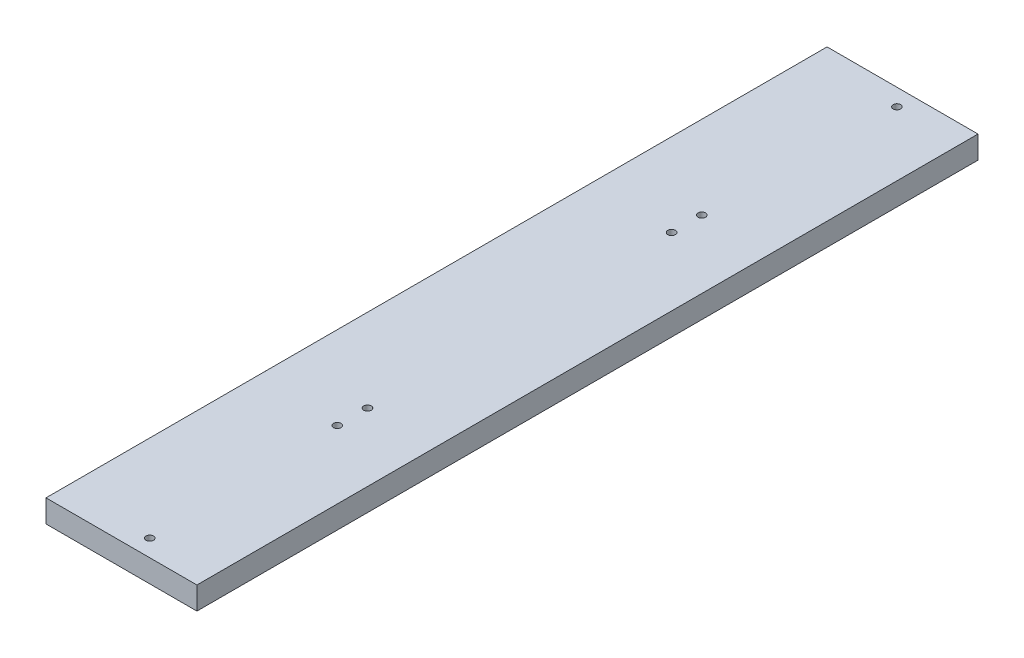
ISO-10303-21;
HEADER;
FILE_DESCRIPTION(('STEP AP214'),'2;1');
FILE_NAME('part.step','',(''),(''),'','','');
FILE_SCHEMA(('AUTOMOTIVE_DESIGN { 1 0 10303 214 1 1 1 1 }'));
ENDSEC;
DATA;
#1=APPLICATION_CONTEXT('core data for automotive mechanical design processes');
#2=APPLICATION_PROTOCOL_DEFINITION('international standard','automotive_design',2000,#1);
#3=PRODUCT_CONTEXT('',#1,'mechanical');
#4=PRODUCT('Part','Part','',(#3));
#5=PRODUCT_RELATED_PRODUCT_CATEGORY('part','',(#4));
#6=PRODUCT_DEFINITION_FORMATION('','',#4);
#7=PRODUCT_DEFINITION_CONTEXT('part definition',#1,'design');
#8=PRODUCT_DEFINITION('design','',#6,#7);
#9=PRODUCT_DEFINITION_SHAPE('','',#8);
#10=(LENGTH_UNIT() NAMED_UNIT(*) SI_UNIT(.MILLI.,.METRE.));
#11=(NAMED_UNIT(*) PLANE_ANGLE_UNIT() SI_UNIT($,.RADIAN.));
#12=(NAMED_UNIT(*) SI_UNIT($,.STERADIAN.) SOLID_ANGLE_UNIT());
#13=UNCERTAINTY_MEASURE_WITH_UNIT(LENGTH_MEASURE(1.E-05),#10,'distance_accuracy_value','');
#14=(GEOMETRIC_REPRESENTATION_CONTEXT(3) GLOBAL_UNCERTAINTY_ASSIGNED_CONTEXT((#13)) GLOBAL_UNIT_ASSIGNED_CONTEXT((#10,
#11,#12)) REPRESENTATION_CONTEXT('',''));
#15=CARTESIAN_POINT('',(0.,0.,0.));
#16=DIRECTION('',(0.,0.,1.));
#17=DIRECTION('',(1.,0.,0.));
#18=AXIS2_PLACEMENT_3D('',#15,#16,#17);
#19=CARTESIAN_POINT('',(0.,0.,0.));
#20=DIRECTION('',(0.,1.,0.));
#21=DIRECTION('',(0.,0.,1.));
#22=AXIS2_PLACEMENT_3D('',#19,#20,#21);
#23=PLANE('',#22);
#24=CARTESIAN_POINT('',(73.025,0.,14.2874999999999));
#25=DIRECTION('',(0.,-1.,0.));
#26=DIRECTION('',(0.,0.,-1.));
#27=AXIS2_PLACEMENT_3D('',#24,#25,#26);
#28=CIRCLE('',#27,3.17499999999998);
#29=CARTESIAN_POINT('',(73.025,0.,11.1124999999999));
#30=VERTEX_POINT('',#29);
#31=EDGE_CURVE('E143',#30,#30,#28,.T.);
#32=ORIENTED_EDGE('',*,*,#31,.F.);
#33=EDGE_LOOP('',(#32));
#34=FACE_BOUND('',#33,.T.);
#35=DIRECTION('',(0.,0.,1.));
#36=VECTOR('',#35,1.);
#37=CARTESIAN_POINT('',(0.,0.,0.));
#38=LINE('',#37,#36);
#39=CARTESIAN_POINT('',(0.,0.,0.));
#40=VERTEX_POINT('',#39);
#41=CARTESIAN_POINT('',(0.,0.,657.225));
#42=VERTEX_POINT('',#41);
#43=EDGE_CURVE('E97',#40,#42,#38,.T.);
#44=ORIENTED_EDGE('',*,*,#43,.F.);
#45=DIRECTION('',(-1.,0.,0.));
#46=VECTOR('',#45,1.);
#47=CARTESIAN_POINT('',(0.,0.,0.));
#48=LINE('',#47,#46);
#49=CARTESIAN_POINT('',(127.,0.,0.));
#50=VERTEX_POINT('',#49);
#51=EDGE_CURVE('E73',#50,#40,#48,.T.);
#52=ORIENTED_EDGE('',*,*,#51,.F.);
#53=DIRECTION('',(0.,0.,-1.));
#54=VECTOR('',#53,1.);
#55=CARTESIAN_POINT('',(127.,0.,0.));
#56=LINE('',#55,#54);
#57=CARTESIAN_POINT('',(127.,0.,657.225));
#58=VERTEX_POINT('',#57);
#59=EDGE_CURVE('E67',#58,#50,#56,.T.);
#60=ORIENTED_EDGE('',*,*,#59,.F.);
#61=DIRECTION('',(1.,0.,0.));
#62=VECTOR('',#61,1.);
#63=CARTESIAN_POINT('',(0.,0.,657.225));
#64=LINE('',#63,#62);
#65=EDGE_CURVE('E89',#42,#58,#64,.T.);
#66=ORIENTED_EDGE('',*,*,#65,.F.);
#67=EDGE_LOOP('',(#44,#52,#60,#66));
#68=FACE_BOUND('',#67,.T.);
#69=CARTESIAN_POINT('',(73.025,0.,642.9375));
#70=DIRECTION('',(0.,-1.,0.));
#71=DIRECTION('',(0.,0.,-1.));
#72=AXIS2_PLACEMENT_3D('',#69,#70,#71);
#73=CIRCLE('',#72,3.17499999999998);
#74=CARTESIAN_POINT('',(73.025,0.,639.7625));
#75=VERTEX_POINT('',#74);
#76=EDGE_CURVE('E113',#75,#75,#73,.T.);
#77=ORIENTED_EDGE('',*,*,#76,.F.);
#78=EDGE_LOOP('',(#77));
#79=FACE_BOUND('',#78,.T.);
#80=CARTESIAN_POINT('',(69.85,0.,481.965));
#81=DIRECTION('',(0.,-1.,0.));
#82=DIRECTION('',(0.,0.,-1.));
#83=AXIS2_PLACEMENT_3D('',#80,#81,#82);
#84=CIRCLE('',#83,3.17499999999998);
#85=CARTESIAN_POINT('',(69.85,0.,478.79));
#86=VERTEX_POINT('',#85);
#87=EDGE_CURVE('E119',#86,#86,#84,.T.);
#88=ORIENTED_EDGE('',*,*,#87,.F.);
#89=EDGE_LOOP('',(#88));
#90=FACE_BOUND('',#89,.T.);
#91=CARTESIAN_POINT('',(69.85,0.,456.565));
#92=DIRECTION('',(0.,-1.,0.));
#93=DIRECTION('',(0.,0.,-1.));
#94=AXIS2_PLACEMENT_3D('',#91,#92,#93);
#95=CIRCLE('',#94,3.17499999999998);
#96=CARTESIAN_POINT('',(69.85,0.,453.39));
#97=VERTEX_POINT('',#96);
#98=EDGE_CURVE('E125',#97,#97,#95,.T.);
#99=ORIENTED_EDGE('',*,*,#98,.F.);
#100=EDGE_LOOP('',(#99));
#101=FACE_BOUND('',#100,.T.);
#102=CARTESIAN_POINT('',(69.85,0.,200.66));
#103=DIRECTION('',(0.,-1.,0.));
#104=DIRECTION('',(0.,0.,-1.));
#105=AXIS2_PLACEMENT_3D('',#102,#103,#104);
#106=CIRCLE('',#105,3.17499999999998);
#107=CARTESIAN_POINT('',(69.85,0.,197.485));
#108=VERTEX_POINT('',#107);
#109=EDGE_CURVE('E131',#108,#108,#106,.T.);
#110=ORIENTED_EDGE('',*,*,#109,.F.);
#111=EDGE_LOOP('',(#110));
#112=FACE_BOUND('',#111,.T.);
#113=CARTESIAN_POINT('',(69.85,0.,175.26));
#114=DIRECTION('',(0.,-1.,0.));
#115=DIRECTION('',(0.,0.,-1.));
#116=AXIS2_PLACEMENT_3D('',#113,#114,#115);
#117=CIRCLE('',#116,3.17499999999998);
#118=CARTESIAN_POINT('',(69.85,0.,172.085));
#119=VERTEX_POINT('',#118);
#120=EDGE_CURVE('E137',#119,#119,#117,.T.);
#121=ORIENTED_EDGE('',*,*,#120,.F.);
#122=EDGE_LOOP('',(#121));
#123=FACE_BOUND('',#122,.T.);
#124=ADVANCED_FACE('F33',(#34,#68,#79,#90,#101,#112,#123),#23,.F.);
#125=CARTESIAN_POINT('',(0.,19.05,0.));
#126=DIRECTION('',(1.,0.,0.));
#127=DIRECTION('',(0.,0.,-1.));
#128=AXIS2_PLACEMENT_3D('',#125,#126,#127);
#129=PLANE('',#128);
#130=ORIENTED_EDGE('',*,*,#43,.T.);
#131=DIRECTION('',(0.,-1.,0.));
#132=VECTOR('',#131,1.);
#133=CARTESIAN_POINT('',(0.,19.05,657.225));
#134=LINE('',#133,#132);
#135=CARTESIAN_POINT('',(0.,19.05,657.225));
#136=VERTEX_POINT('',#135);
#137=EDGE_CURVE('E11',#136,#42,#134,.T.);
#138=ORIENTED_EDGE('',*,*,#137,.F.);
#139=DIRECTION('',(0.,0.,1.));
#140=VECTOR('',#139,1.);
#141=CARTESIAN_POINT('',(0.,19.05,0.));
#142=LINE('',#141,#140);
#143=CARTESIAN_POINT('',(0.,19.05,0.));
#144=VERTEX_POINT('',#143);
#145=EDGE_CURVE('E85',#144,#136,#142,.T.);
#146=ORIENTED_EDGE('',*,*,#145,.F.);
#147=DIRECTION('',(0.,-1.,0.));
#148=VECTOR('',#147,1.);
#149=CARTESIAN_POINT('',(0.,19.05,0.));
#150=LINE('',#149,#148);
#151=EDGE_CURVE('E93',#144,#40,#150,.T.);
#152=ORIENTED_EDGE('',*,*,#151,.T.);
#153=EDGE_LOOP('',(#130,#138,#146,#152));
#154=FACE_BOUND('',#153,.T.);
#155=ADVANCED_FACE('F35',(#154),#129,.F.);
#156=CARTESIAN_POINT('',(0.,19.05,657.225));
#157=DIRECTION('',(0.,0.,-1.));
#158=DIRECTION('',(-1.,0.,0.));
#159=AXIS2_PLACEMENT_3D('',#156,#157,#158);
#160=PLANE('',#159);
#161=ORIENTED_EDGE('',*,*,#65,.T.);
#162=DIRECTION('',(0.,-1.,0.));
#163=VECTOR('',#162,1.);
#164=CARTESIAN_POINT('',(127.,19.05,657.225));
#165=LINE('',#164,#163);
#166=CARTESIAN_POINT('',(127.,19.05,657.225));
#167=VERTEX_POINT('',#166);
#168=EDGE_CURVE('E42',#167,#58,#165,.T.);
#169=ORIENTED_EDGE('',*,*,#168,.F.);
#170=DIRECTION('',(1.,0.,0.));
#171=VECTOR('',#170,1.);
#172=CARTESIAN_POINT('',(0.,19.05,657.225));
#173=LINE('',#172,#171);
#174=EDGE_CURVE('E80',#136,#167,#173,.T.);
#175=ORIENTED_EDGE('',*,*,#174,.F.);
#176=ORIENTED_EDGE('',*,*,#137,.T.);
#177=EDGE_LOOP('',(#161,#169,#175,#176));
#178=FACE_BOUND('',#177,.T.);
#179=ADVANCED_FACE('F88',(#178),#160,.F.);
#180=CARTESIAN_POINT('',(127.,19.05,0.));
#181=DIRECTION('',(-1.,0.,0.));
#182=DIRECTION('',(0.,0.,1.));
#183=AXIS2_PLACEMENT_3D('',#180,#181,#182);
#184=PLANE('',#183);
#185=ORIENTED_EDGE('',*,*,#59,.T.);
#186=DIRECTION('',(0.,-1.,0.));
#187=VECTOR('',#186,1.);
#188=CARTESIAN_POINT('',(127.,19.05,0.));
#189=LINE('',#188,#187);
#190=CARTESIAN_POINT('',(127.,19.05,0.));
#191=VERTEX_POINT('',#190);
#192=EDGE_CURVE('E90',#191,#50,#189,.T.);
#193=ORIENTED_EDGE('',*,*,#192,.F.);
#194=DIRECTION('',(0.,0.,-1.));
#195=VECTOR('',#194,1.);
#196=CARTESIAN_POINT('',(127.,19.05,0.));
#197=LINE('',#196,#195);
#198=EDGE_CURVE('E83',#167,#191,#197,.T.);
#199=ORIENTED_EDGE('',*,*,#198,.F.);
#200=ORIENTED_EDGE('',*,*,#168,.T.);
#201=EDGE_LOOP('',(#185,#193,#199,#200));
#202=FACE_BOUND('',#201,.T.);
#203=ADVANCED_FACE('F91',(#202),#184,.F.);
#204=CARTESIAN_POINT('',(0.,19.05,0.));
#205=DIRECTION('',(0.,0.,1.));
#206=DIRECTION('',(1.,0.,0.));
#207=AXIS2_PLACEMENT_3D('',#204,#205,#206);
#208=PLANE('',#207);
#209=ORIENTED_EDGE('',*,*,#51,.T.);
#210=ORIENTED_EDGE('',*,*,#151,.F.);
#211=DIRECTION('',(-1.,0.,0.));
#212=VECTOR('',#211,1.);
#213=CARTESIAN_POINT('',(0.,19.05,0.));
#214=LINE('',#213,#212);
#215=EDGE_CURVE('E50',#191,#144,#214,.T.);
#216=ORIENTED_EDGE('',*,*,#215,.F.);
#217=ORIENTED_EDGE('',*,*,#192,.T.);
#218=EDGE_LOOP('',(#209,#210,#216,#217));
#219=FACE_BOUND('',#218,.T.);
#220=ADVANCED_FACE('F105',(#219),#208,.F.);
#221=CARTESIAN_POINT('',(0.,19.05,0.));
#222=DIRECTION('',(0.,1.,0.));
#223=DIRECTION('',(0.,0.,1.));
#224=AXIS2_PLACEMENT_3D('',#221,#222,#223);
#225=PLANE('',#224);
#226=CARTESIAN_POINT('',(73.025,19.05,14.2874999999999));
#227=DIRECTION('',(0.,1.,0.));
#228=DIRECTION('',(0.,0.,1.));
#229=AXIS2_PLACEMENT_3D('',#226,#227,#228);
#230=CIRCLE('',#229,3.17499999999999);
#231=CARTESIAN_POINT('',(73.025,19.05,17.4624999999999));
#232=VERTEX_POINT('',#231);
#233=EDGE_CURVE('E140',#232,#232,#230,.T.);
#234=ORIENTED_EDGE('',*,*,#233,.F.);
#235=EDGE_LOOP('',(#234));
#236=FACE_BOUND('',#235,.T.);
#237=CARTESIAN_POINT('',(69.85,19.05,175.26));
#238=DIRECTION('',(0.,1.,0.));
#239=DIRECTION('',(0.,0.,1.));
#240=AXIS2_PLACEMENT_3D('',#237,#238,#239);
#241=CIRCLE('',#240,3.17499999999999);
#242=CARTESIAN_POINT('',(69.85,19.05,178.435));
#243=VERTEX_POINT('',#242);
#244=EDGE_CURVE('E134',#243,#243,#241,.T.);
#245=ORIENTED_EDGE('',*,*,#244,.F.);
#246=EDGE_LOOP('',(#245));
#247=FACE_BOUND('',#246,.T.);
#248=CARTESIAN_POINT('',(69.85,19.05,200.66));
#249=DIRECTION('',(0.,1.,0.));
#250=DIRECTION('',(0.,0.,1.));
#251=AXIS2_PLACEMENT_3D('',#248,#249,#250);
#252=CIRCLE('',#251,3.17499999999999);
#253=CARTESIAN_POINT('',(69.85,19.05,203.835));
#254=VERTEX_POINT('',#253);
#255=EDGE_CURVE('E128',#254,#254,#252,.T.);
#256=ORIENTED_EDGE('',*,*,#255,.F.);
#257=EDGE_LOOP('',(#256));
#258=FACE_BOUND('',#257,.T.);
#259=CARTESIAN_POINT('',(69.85,19.05,456.565));
#260=DIRECTION('',(0.,1.,0.));
#261=DIRECTION('',(0.,0.,1.));
#262=AXIS2_PLACEMENT_3D('',#259,#260,#261);
#263=CIRCLE('',#262,3.17499999999999);
#264=CARTESIAN_POINT('',(69.85,19.05,459.74));
#265=VERTEX_POINT('',#264);
#266=EDGE_CURVE('E122',#265,#265,#263,.T.);
#267=ORIENTED_EDGE('',*,*,#266,.F.);
#268=EDGE_LOOP('',(#267));
#269=FACE_BOUND('',#268,.T.);
#270=CARTESIAN_POINT('',(69.85,19.05,481.965));
#271=DIRECTION('',(0.,1.,0.));
#272=DIRECTION('',(0.,0.,1.));
#273=AXIS2_PLACEMENT_3D('',#270,#271,#272);
#274=CIRCLE('',#273,3.17499999999999);
#275=CARTESIAN_POINT('',(69.85,19.05,485.14));
#276=VERTEX_POINT('',#275);
#277=EDGE_CURVE('E116',#276,#276,#274,.T.);
#278=ORIENTED_EDGE('',*,*,#277,.F.);
#279=EDGE_LOOP('',(#278));
#280=FACE_BOUND('',#279,.T.);
#281=CARTESIAN_POINT('',(73.025,19.05,642.9375));
#282=DIRECTION('',(0.,1.,0.));
#283=DIRECTION('',(0.,0.,1.));
#284=AXIS2_PLACEMENT_3D('',#281,#282,#283);
#285=CIRCLE('',#284,3.17499999999999);
#286=CARTESIAN_POINT('',(73.025,19.05,646.1125));
#287=VERTEX_POINT('',#286);
#288=EDGE_CURVE('E100',#287,#287,#285,.T.);
#289=ORIENTED_EDGE('',*,*,#288,.F.);
#290=EDGE_LOOP('',(#289));
#291=FACE_BOUND('',#290,.T.);
#292=ORIENTED_EDGE('',*,*,#145,.T.);
#293=ORIENTED_EDGE('',*,*,#174,.T.);
#294=ORIENTED_EDGE('',*,*,#198,.T.);
#295=ORIENTED_EDGE('',*,*,#215,.T.);
#296=EDGE_LOOP('',(#292,#293,#294,#295));
#297=FACE_BOUND('',#296,.T.);
#298=ADVANCED_FACE('F81',(#236,#247,#258,#269,#280,#291,#297),#225,.T.);
#299=CARTESIAN_POINT('',(73.025,0.,642.9375));
#300=DIRECTION('',(0.,-1.,0.));
#301=DIRECTION('',(0.,0.,-1.));
#302=AXIS2_PLACEMENT_3D('',#299,#300,#301);
#303=CYLINDRICAL_SURFACE('',#302,3.17499999999999);
#304=ORIENTED_EDGE('',*,*,#76,.T.);
#305=EDGE_LOOP('',(#304));
#306=FACE_BOUND('',#305,.T.);
#307=ORIENTED_EDGE('',*,*,#288,.T.);
#308=EDGE_LOOP('',(#307));
#309=FACE_BOUND('',#308,.T.);
#310=ADVANCED_FACE('F180',(#306,#309),#303,.F.);
#311=CARTESIAN_POINT('',(69.85,0.,481.965));
#312=DIRECTION('',(0.,-1.,0.));
#313=DIRECTION('',(0.,0.,-1.));
#314=AXIS2_PLACEMENT_3D('',#311,#312,#313);
#315=CYLINDRICAL_SURFACE('',#314,3.17499999999999);
#316=ORIENTED_EDGE('',*,*,#87,.T.);
#317=EDGE_LOOP('',(#316));
#318=FACE_BOUND('',#317,.T.);
#319=ORIENTED_EDGE('',*,*,#277,.T.);
#320=EDGE_LOOP('',(#319));
#321=FACE_BOUND('',#320,.T.);
#322=ADVANCED_FACE('F187',(#318,#321),#315,.F.);
#323=CARTESIAN_POINT('',(69.85,0.,456.565));
#324=DIRECTION('',(0.,-1.,0.));
#325=DIRECTION('',(0.,0.,-1.));
#326=AXIS2_PLACEMENT_3D('',#323,#324,#325);
#327=CYLINDRICAL_SURFACE('',#326,3.17499999999999);
#328=ORIENTED_EDGE('',*,*,#98,.T.);
#329=EDGE_LOOP('',(#328));
#330=FACE_BOUND('',#329,.T.);
#331=ORIENTED_EDGE('',*,*,#266,.T.);
#332=EDGE_LOOP('',(#331));
#333=FACE_BOUND('',#332,.T.);
#334=ADVANCED_FACE('F194',(#330,#333),#327,.F.);
#335=CARTESIAN_POINT('',(69.85,0.,200.66));
#336=DIRECTION('',(0.,-1.,0.));
#337=DIRECTION('',(0.,0.,-1.));
#338=AXIS2_PLACEMENT_3D('',#335,#336,#337);
#339=CYLINDRICAL_SURFACE('',#338,3.17499999999999);
#340=ORIENTED_EDGE('',*,*,#109,.T.);
#341=EDGE_LOOP('',(#340));
#342=FACE_BOUND('',#341,.T.);
#343=ORIENTED_EDGE('',*,*,#255,.T.);
#344=EDGE_LOOP('',(#343));
#345=FACE_BOUND('',#344,.T.);
#346=ADVANCED_FACE('F202',(#342,#345),#339,.F.);
#347=CARTESIAN_POINT('',(69.85,0.,175.26));
#348=DIRECTION('',(0.,-1.,0.));
#349=DIRECTION('',(0.,0.,-1.));
#350=AXIS2_PLACEMENT_3D('',#347,#348,#349);
#351=CYLINDRICAL_SURFACE('',#350,3.17499999999999);
#352=ORIENTED_EDGE('',*,*,#120,.T.);
#353=EDGE_LOOP('',(#352));
#354=FACE_BOUND('',#353,.T.);
#355=ORIENTED_EDGE('',*,*,#244,.T.);
#356=EDGE_LOOP('',(#355));
#357=FACE_BOUND('',#356,.T.);
#358=ADVANCED_FACE('F210',(#354,#357),#351,.F.);
#359=CARTESIAN_POINT('',(73.025,0.,14.2874999999999));
#360=DIRECTION('',(0.,-1.,0.));
#361=DIRECTION('',(0.,0.,-1.));
#362=AXIS2_PLACEMENT_3D('',#359,#360,#361);
#363=CYLINDRICAL_SURFACE('',#362,3.17499999999999);
#364=ORIENTED_EDGE('',*,*,#31,.T.);
#365=EDGE_LOOP('',(#364));
#366=FACE_BOUND('',#365,.T.);
#367=ORIENTED_EDGE('',*,*,#233,.T.);
#368=EDGE_LOOP('',(#367));
#369=FACE_BOUND('',#368,.T.);
#370=ADVANCED_FACE('F147',(#366,#369),#363,.F.);
#371=CLOSED_SHELL('',(#124,#155,#179,#203,#220,#298,#310,#322,#334,#346,#358,#370));
#372=MANIFOLD_SOLID_BREP('B2',#371);
#373=ADVANCED_BREP_SHAPE_REPRESENTATION('',(#18,#372),#14);
#374=SHAPE_DEFINITION_REPRESENTATION(#9,#373);
ENDSEC;
END-ISO-10303-21;
